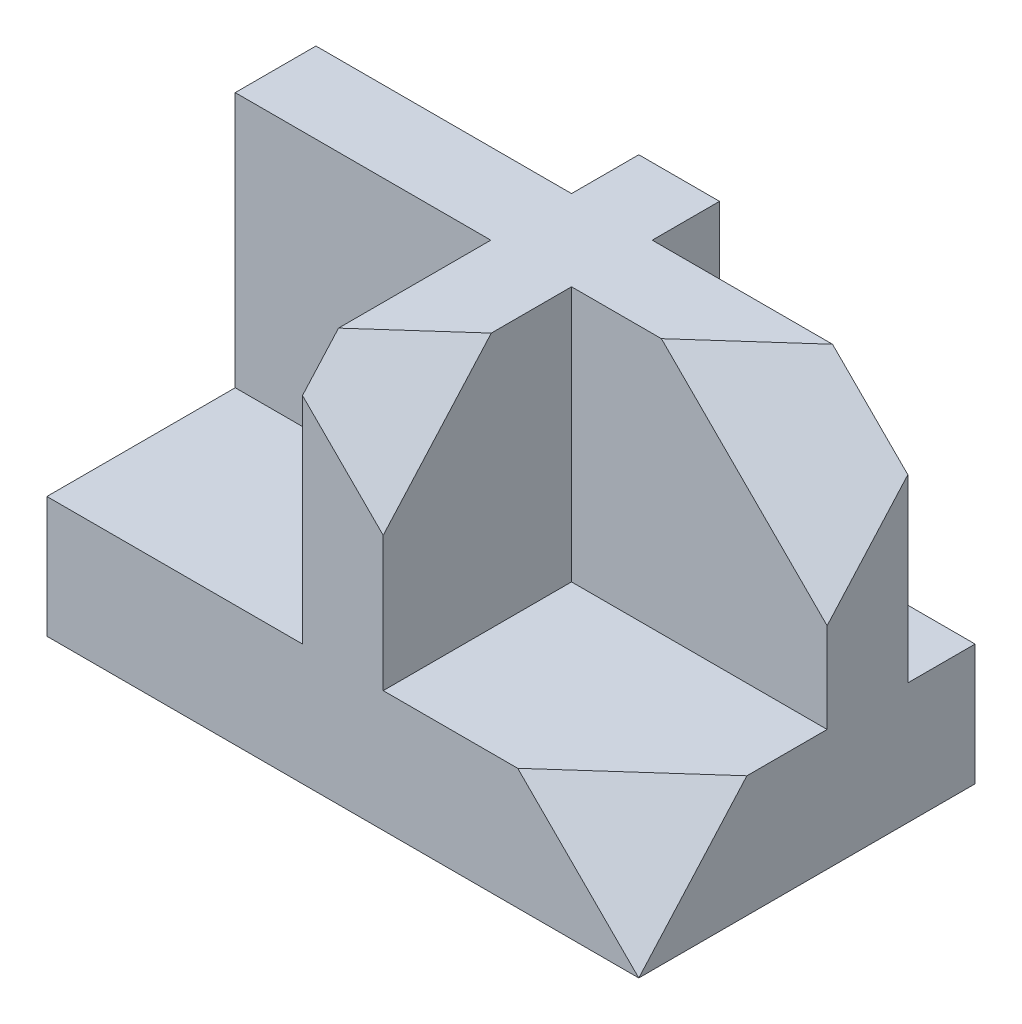
ISO-10303-21;
HEADER;
FILE_DESCRIPTION(('STEP AP214'),'2;1');
FILE_NAME('part.step','',(''),(''),'','','');
FILE_SCHEMA(('AUTOMOTIVE_DESIGN { 1 0 10303 214 1 1 1 1 }'));
ENDSEC;
DATA;
#1=APPLICATION_CONTEXT('core data for automotive mechanical design processes');
#2=APPLICATION_PROTOCOL_DEFINITION('international standard','automotive_design',2000,#1);
#3=PRODUCT_CONTEXT('',#1,'mechanical');
#4=PRODUCT('Part','Part','',(#3));
#5=PRODUCT_RELATED_PRODUCT_CATEGORY('part','',(#4));
#6=PRODUCT_DEFINITION_FORMATION('','',#4);
#7=PRODUCT_DEFINITION_CONTEXT('part definition',#1,'design');
#8=PRODUCT_DEFINITION('design','',#6,#7);
#9=PRODUCT_DEFINITION_SHAPE('','',#8);
#10=(LENGTH_UNIT() NAMED_UNIT(*) SI_UNIT(.MILLI.,.METRE.));
#11=(NAMED_UNIT(*) PLANE_ANGLE_UNIT() SI_UNIT($,.RADIAN.));
#12=(NAMED_UNIT(*) SI_UNIT($,.STERADIAN.) SOLID_ANGLE_UNIT());
#13=UNCERTAINTY_MEASURE_WITH_UNIT(LENGTH_MEASURE(1.E-05),#10,'distance_accuracy_value','');
#14=(GEOMETRIC_REPRESENTATION_CONTEXT(3) GLOBAL_UNCERTAINTY_ASSIGNED_CONTEXT((#13)) GLOBAL_UNIT_ASSIGNED_CONTEXT((#10,
#11,#12)) REPRESENTATION_CONTEXT('',''));
#15=CARTESIAN_POINT('',(0.,0.,0.));
#16=DIRECTION('',(0.,0.,1.));
#17=DIRECTION('',(1.,0.,0.));
#18=AXIS2_PLACEMENT_3D('',#15,#16,#17);
#19=CARTESIAN_POINT('',(0.,18.,0.));
#20=DIRECTION('',(0.,-1.,0.));
#21=DIRECTION('',(0.,0.,-1.));
#22=AXIS2_PLACEMENT_3D('',#19,#20,#21);
#23=PLANE('',#22);
#24=DIRECTION('',(-1.,0.,0.));
#25=VECTOR('',#24,1.);
#26=CARTESIAN_POINT('',(-44.,18.,-15.));
#27=LINE('',#26,#25);
#28=CARTESIAN_POINT('',(-6.,18.,-15.));
#29=VERTEX_POINT('',#28);
#30=CARTESIAN_POINT('',(-44.,18.,-15.));
#31=VERTEX_POINT('',#30);
#32=EDGE_CURVE('E294',#29,#31,#27,.T.);
#33=ORIENTED_EDGE('',*,*,#32,.F.);
#34=DIRECTION('',(0.,0.,1.));
#35=VECTOR('',#34,1.);
#36=CARTESIAN_POINT('',(-6.,18.,-15.));
#37=LINE('',#36,#35);
#38=CARTESIAN_POINT('',(-6.,18.,-25.));
#39=VERTEX_POINT('',#38);
#40=EDGE_CURVE('E290',#39,#29,#37,.T.);
#41=ORIENTED_EDGE('',*,*,#40,.F.);
#42=DIRECTION('',(-1.,0.,0.));
#43=VECTOR('',#42,1.);
#44=CARTESIAN_POINT('',(-44.,18.,-25.));
#45=LINE('',#44,#43);
#46=CARTESIAN_POINT('',(-44.,18.,-25.));
#47=VERTEX_POINT('',#46);
#48=EDGE_CURVE('E337',#39,#47,#45,.T.);
#49=ORIENTED_EDGE('',*,*,#48,.T.);
#50=DIRECTION('',(0.,0.,1.));
#51=VECTOR('',#50,1.);
#52=CARTESIAN_POINT('',(-44.,18.,25.));
#53=LINE('',#52,#51);
#54=EDGE_CURVE('E341',#47,#31,#53,.T.);
#55=ORIENTED_EDGE('',*,*,#54,.T.);
#56=EDGE_LOOP('',(#33,#41,#49,#55));
#57=FACE_BOUND('',#56,.T.);
#58=ADVANCED_FACE('F41',(#57),#23,.F.);
#59=DIRECTION('',(0.,0.,-1.));
#60=VECTOR('',#59,1.);
#61=CARTESIAN_POINT('',(6.,18.,-25.));
#62=LINE('',#61,#60);
#63=CARTESIAN_POINT('',(6.,18.,-15.));
#64=VERTEX_POINT('',#63);
#65=CARTESIAN_POINT('',(6.00000000000001,18.,-25.));
#66=VERTEX_POINT('',#65);
#67=EDGE_CURVE('E286',#64,#66,#62,.T.);
#68=ORIENTED_EDGE('',*,*,#67,.F.);
#69=DIRECTION('',(-1.,0.,0.));
#70=VECTOR('',#69,1.);
#71=CARTESIAN_POINT('',(6.,18.,-15.));
#72=LINE('',#71,#70);
#73=CARTESIAN_POINT('',(44.,18.,-15.));
#74=VERTEX_POINT('',#73);
#75=EDGE_CURVE('E283',#74,#64,#72,.T.);
#76=ORIENTED_EDGE('',*,*,#75,.F.);
#77=DIRECTION('',(0.,0.,-1.));
#78=VECTOR('',#77,1.);
#79=CARTESIAN_POINT('',(44.,18.,25.));
#80=LINE('',#79,#78);
#81=CARTESIAN_POINT('',(44.,18.,-25.));
#82=VERTEX_POINT('',#81);
#83=EDGE_CURVE('E200',#74,#82,#80,.T.);
#84=ORIENTED_EDGE('',*,*,#83,.T.);
#85=EDGE_CURVE('E338',#82,#66,#45,.T.);
#86=ORIENTED_EDGE('',*,*,#85,.T.);
#87=EDGE_LOOP('',(#68,#76,#84,#86));
#88=FACE_BOUND('',#87,.T.);
#89=ADVANCED_FACE('F411',(#88),#23,.F.);
#90=DIRECTION('',(1.,0.,0.));
#91=VECTOR('',#90,1.);
#92=CARTESIAN_POINT('',(-44.,18.,25.));
#93=LINE('',#92,#91);
#94=CARTESIAN_POINT('',(6.00000000000001,18.,25.));
#95=VERTEX_POINT('',#94);
#96=CARTESIAN_POINT('',(25.9999999999998,18.,25.));
#97=VERTEX_POINT('',#96);
#98=EDGE_CURVE('E343',#95,#97,#93,.T.);
#99=ORIENTED_EDGE('',*,*,#98,.T.);
#100=DIRECTION('',(0.745937661625918,0.,-0.666015769308848));
#101=VECTOR('',#100,1.);
#102=CARTESIAN_POINT('',(23.9531582682751,18.,26.8275372604685));
#103=LINE('',#102,#101);
#104=CARTESIAN_POINT('',(44.,18.,8.92857142857147));
#105=VERTEX_POINT('',#104);
#106=EDGE_CURVE('E57',#97,#105,#103,.T.);
#107=ORIENTED_EDGE('',*,*,#106,.T.);
#108=CARTESIAN_POINT('',(44.,18.,-3.));
#109=VERTEX_POINT('',#108);
#110=EDGE_CURVE('E186',#105,#109,#80,.T.);
#111=ORIENTED_EDGE('',*,*,#110,.T.);
#112=DIRECTION('',(1.,0.,0.));
#113=VECTOR('',#112,1.);
#114=CARTESIAN_POINT('',(44.,18.,-3.));
#115=LINE('',#114,#113);
#116=CARTESIAN_POINT('',(6.00000000000001,18.,-3.));
#117=VERTEX_POINT('',#116);
#118=EDGE_CURVE('E279',#117,#109,#115,.T.);
#119=ORIENTED_EDGE('',*,*,#118,.F.);
#120=DIRECTION('',(0.,0.,-1.));
#121=VECTOR('',#120,1.);
#122=CARTESIAN_POINT('',(6.00000000000001,18.,-3.));
#123=LINE('',#122,#121);
#124=EDGE_CURVE('E275',#95,#117,#123,.T.);
#125=ORIENTED_EDGE('',*,*,#124,.F.);
#126=EDGE_LOOP('',(#99,#107,#111,#119,#125));
#127=FACE_BOUND('',#126,.T.);
#128=ADVANCED_FACE('F402',(#127),#23,.F.);
#129=DIRECTION('',(0.,0.,1.));
#130=VECTOR('',#129,1.);
#131=CARTESIAN_POINT('',(-6.,18.,25.));
#132=LINE('',#131,#130);
#133=CARTESIAN_POINT('',(-6.,18.,-3.));
#134=VERTEX_POINT('',#133);
#135=CARTESIAN_POINT('',(-6.,18.,25.));
#136=VERTEX_POINT('',#135);
#137=EDGE_CURVE('E271',#134,#136,#132,.T.);
#138=ORIENTED_EDGE('',*,*,#137,.F.);
#139=DIRECTION('',(1.,0.,0.));
#140=VECTOR('',#139,1.);
#141=CARTESIAN_POINT('',(-6.,18.,-3.));
#142=LINE('',#141,#140);
#143=CARTESIAN_POINT('',(-44.,18.,-3.));
#144=VERTEX_POINT('',#143);
#145=EDGE_CURVE('E267',#144,#134,#142,.T.);
#146=ORIENTED_EDGE('',*,*,#145,.F.);
#147=CARTESIAN_POINT('',(-44.,18.,25.));
#148=VERTEX_POINT('',#147);
#149=EDGE_CURVE('E340',#144,#148,#53,.T.);
#150=ORIENTED_EDGE('',*,*,#149,.T.);
#151=EDGE_CURVE('E216',#148,#136,#93,.T.);
#152=ORIENTED_EDGE('',*,*,#151,.T.);
#153=EDGE_LOOP('',(#138,#146,#150,#152));
#154=FACE_BOUND('',#153,.T.);
#155=ADVANCED_FACE('F351',(#154),#23,.F.);
#156=CARTESIAN_POINT('',(44.,18.,25.));
#157=DIRECTION('',(-1.,0.,0.));
#158=DIRECTION('',(0.,0.,1.));
#159=AXIS2_PLACEMENT_3D('',#156,#157,#158);
#160=PLANE('',#159);
#161=DIRECTION('',(0.,-1.,0.));
#162=VECTOR('',#161,1.);
#163=CARTESIAN_POINT('',(44.,56.,-15.));
#164=LINE('',#163,#162);
#165=CARTESIAN_POINT('',(44.,44.8,-15.));
#166=VERTEX_POINT('',#165);
#167=EDGE_CURVE('E316',#166,#74,#164,.T.);
#168=ORIENTED_EDGE('',*,*,#167,.F.);
#169=DIRECTION('',(0.,0.745937661625915,-0.666015769308853));
#170=VECTOR('',#169,1.);
#171=CARTESIAN_POINT('',(44.,56.,-25.));
#172=LINE('',#171,#170);
#173=CARTESIAN_POINT('',(44.,31.36,-3.00000000000001));
#174=VERTEX_POINT('',#173);
#175=EDGE_CURVE('E188',#174,#166,#172,.T.);
#176=ORIENTED_EDGE('',*,*,#175,.F.);
#177=DIRECTION('',(0.,-1.,0.));
#178=VECTOR('',#177,1.);
#179=CARTESIAN_POINT('',(44.,56.,-3.));
#180=LINE('',#179,#178);
#181=EDGE_CURVE('E319',#174,#109,#180,.T.);
#182=ORIENTED_EDGE('',*,*,#181,.T.);
#183=ORIENTED_EDGE('',*,*,#110,.F.);
#184=CARTESIAN_POINT('',(44.,0.,25.));
#185=VERTEX_POINT('',#184);
#186=EDGE_CURVE('E170',#185,#105,#172,.T.);
#187=ORIENTED_EDGE('',*,*,#186,.F.);
#188=DIRECTION('',(0.,0.,-1.));
#189=VECTOR('',#188,1.);
#190=CARTESIAN_POINT('',(44.,0.,25.));
#191=LINE('',#190,#189);
#192=CARTESIAN_POINT('',(44.,0.,-25.));
#193=VERTEX_POINT('',#192);
#194=EDGE_CURVE('E184',#185,#193,#191,.T.);
#195=ORIENTED_EDGE('',*,*,#194,.T.);
#196=DIRECTION('',(0.,-1.,0.));
#197=VECTOR('',#196,1.);
#198=CARTESIAN_POINT('',(44.,18.,-25.));
#199=LINE('',#198,#197);
#200=EDGE_CURVE('E226',#82,#193,#199,.T.);
#201=ORIENTED_EDGE('',*,*,#200,.F.);
#202=ORIENTED_EDGE('',*,*,#83,.F.);
#203=EDGE_LOOP('',(#168,#176,#182,#183,#187,#195,#201,#202));
#204=FACE_BOUND('',#203,.T.);
#205=ADVANCED_FACE('F43',(#204),#160,.F.);
#206=CARTESIAN_POINT('',(-44.,18.,-25.));
#207=DIRECTION('',(0.,0.,1.));
#208=DIRECTION('',(1.,0.,0.));
#209=AXIS2_PLACEMENT_3D('',#206,#207,#208);
#210=PLANE('',#209);
#211=DIRECTION('',(-1.,0.,0.));
#212=VECTOR('',#211,1.);
#213=CARTESIAN_POINT('',(-44.,0.,-25.));
#214=LINE('',#213,#212);
#215=CARTESIAN_POINT('',(-44.,0.,-25.));
#216=VERTEX_POINT('',#215);
#217=EDGE_CURVE('E204',#193,#216,#214,.T.);
#218=ORIENTED_EDGE('',*,*,#217,.T.);
#219=DIRECTION('',(0.,-1.,0.));
#220=VECTOR('',#219,1.);
#221=CARTESIAN_POINT('',(-44.,18.,-25.));
#222=LINE('',#221,#220);
#223=EDGE_CURVE('E223',#47,#216,#222,.T.);
#224=ORIENTED_EDGE('',*,*,#223,.F.);
#225=ORIENTED_EDGE('',*,*,#48,.F.);
#226=DIRECTION('',(0.,-1.,0.));
#227=VECTOR('',#226,1.);
#228=CARTESIAN_POINT('',(-6.,56.,-25.));
#229=LINE('',#228,#227);
#230=CARTESIAN_POINT('',(-6.,56.,-25.));
#231=VERTEX_POINT('',#230);
#232=EDGE_CURVE('E306',#231,#39,#229,.T.);
#233=ORIENTED_EDGE('',*,*,#232,.F.);
#234=DIRECTION('',(-1.,0.,0.));
#235=VECTOR('',#234,1.);
#236=CARTESIAN_POINT('',(-6.,56.,-25.));
#237=LINE('',#236,#235);
#238=CARTESIAN_POINT('',(6.,56.,-25.));
#239=VERTEX_POINT('',#238);
#240=EDGE_CURVE('E252',#239,#231,#237,.T.);
#241=ORIENTED_EDGE('',*,*,#240,.F.);
#242=DIRECTION('',(0.,-1.,0.));
#243=VECTOR('',#242,1.);
#244=CARTESIAN_POINT('',(6.,56.,-25.));
#245=LINE('',#244,#243);
#246=EDGE_CURVE('E310',#239,#66,#245,.T.);
#247=ORIENTED_EDGE('',*,*,#246,.T.);
#248=ORIENTED_EDGE('',*,*,#85,.F.);
#249=ORIENTED_EDGE('',*,*,#200,.T.);
#250=EDGE_LOOP('',(#218,#224,#225,#233,#241,#247,#248,#249));
#251=FACE_BOUND('',#250,.T.);
#252=ADVANCED_FACE('F416',(#251),#210,.F.);
#253=CARTESIAN_POINT('',(-44.,18.,25.));
#254=DIRECTION('',(1.,0.,0.));
#255=DIRECTION('',(0.,0.,-1.));
#256=AXIS2_PLACEMENT_3D('',#253,#254,#255);
#257=PLANE('',#256);
#258=DIRECTION('',(0.,0.,1.));
#259=VECTOR('',#258,1.);
#260=CARTESIAN_POINT('',(-44.,0.,25.));
#261=LINE('',#260,#259);
#262=CARTESIAN_POINT('',(-44.,0.,25.));
#263=VERTEX_POINT('',#262);
#264=EDGE_CURVE('E201',#216,#263,#261,.T.);
#265=ORIENTED_EDGE('',*,*,#264,.T.);
#266=DIRECTION('',(0.,-1.,0.));
#267=VECTOR('',#266,1.);
#268=CARTESIAN_POINT('',(-44.,18.,25.));
#269=LINE('',#268,#267);
#270=EDGE_CURVE('E196',#148,#263,#269,.T.);
#271=ORIENTED_EDGE('',*,*,#270,.F.);
#272=ORIENTED_EDGE('',*,*,#149,.F.);
#273=DIRECTION('',(0.,-1.,0.));
#274=VECTOR('',#273,1.);
#275=CARTESIAN_POINT('',(-44.,56.,-2.99999999999999));
#276=LINE('',#275,#274);
#277=CARTESIAN_POINT('',(-44.,56.,-2.99999999999999));
#278=VERTEX_POINT('',#277);
#279=EDGE_CURVE('E207',#278,#144,#276,.T.);
#280=ORIENTED_EDGE('',*,*,#279,.F.);
#281=DIRECTION('',(0.,0.,1.));
#282=VECTOR('',#281,1.);
#283=CARTESIAN_POINT('',(-44.,56.,-2.99999999999999));
#284=LINE('',#283,#282);
#285=CARTESIAN_POINT('',(-44.,56.,-15.));
#286=VERTEX_POINT('',#285);
#287=EDGE_CURVE('E298',#286,#278,#284,.T.);
#288=ORIENTED_EDGE('',*,*,#287,.F.);
#289=DIRECTION('',(0.,-1.,0.));
#290=VECTOR('',#289,1.);
#291=CARTESIAN_POINT('',(-44.,56.,-15.));
#292=LINE('',#291,#290);
#293=EDGE_CURVE('E266',#286,#31,#292,.T.);
#294=ORIENTED_EDGE('',*,*,#293,.T.);
#295=ORIENTED_EDGE('',*,*,#54,.F.);
#296=ORIENTED_EDGE('',*,*,#223,.T.);
#297=EDGE_LOOP('',(#265,#271,#272,#280,#288,#294,#295,#296));
#298=FACE_BOUND('',#297,.T.);
#299=ADVANCED_FACE('F354',(#298),#257,.F.);
#300=CARTESIAN_POINT('',(-44.,18.,25.));
#301=DIRECTION('',(0.,0.,-1.));
#302=DIRECTION('',(-1.,0.,0.));
#303=AXIS2_PLACEMENT_3D('',#300,#301,#302);
#304=PLANE('',#303);
#305=DIRECTION('',(1.,0.,0.));
#306=VECTOR('',#305,1.);
#307=CARTESIAN_POINT('',(-44.,0.,25.));
#308=LINE('',#307,#306);
#309=EDGE_CURVE('E192',#263,#185,#308,.T.);
#310=ORIENTED_EDGE('',*,*,#309,.T.);
#311=DIRECTION('',(0.707106781186552,-0.707106781186544,0.));
#312=VECTOR('',#311,1.);
#313=CARTESIAN_POINT('',(44.,0.,25.));
#314=LINE('',#313,#312);
#315=EDGE_CURVE('E167',#97,#185,#314,.T.);
#316=ORIENTED_EDGE('',*,*,#315,.F.);
#317=ORIENTED_EDGE('',*,*,#98,.F.);
#318=DIRECTION('',(0.,-1.,0.));
#319=VECTOR('',#318,1.);
#320=CARTESIAN_POINT('',(6.00000000000001,56.,25.));
#321=LINE('',#320,#319);
#322=CARTESIAN_POINT('',(6.,37.9999999999996,25.));
#323=VERTEX_POINT('',#322);
#324=EDGE_CURVE('E326',#323,#95,#321,.T.);
#325=ORIENTED_EDGE('',*,*,#324,.F.);
#326=CARTESIAN_POINT('',(-6.00000000000001,49.9999999999995,25.));
#327=VERTEX_POINT('',#326);
#328=EDGE_CURVE('E176',#327,#323,#314,.T.);
#329=ORIENTED_EDGE('',*,*,#328,.F.);
#330=DIRECTION('',(0.,-1.,0.));
#331=VECTOR('',#330,1.);
#332=CARTESIAN_POINT('',(-6.,56.,25.));
#333=LINE('',#332,#331);
#334=EDGE_CURVE('E329',#327,#136,#333,.T.);
#335=ORIENTED_EDGE('',*,*,#334,.T.);
#336=ORIENTED_EDGE('',*,*,#151,.F.);
#337=ORIENTED_EDGE('',*,*,#270,.T.);
#338=EDGE_LOOP('',(#310,#316,#317,#325,#329,#335,#336,#337));
#339=FACE_BOUND('',#338,.T.);
#340=ADVANCED_FACE('F193',(#339),#304,.F.);
#341=CARTESIAN_POINT('',(0.,0.,0.));
#342=DIRECTION('',(0.,-1.,0.));
#343=DIRECTION('',(0.,0.,-1.));
#344=AXIS2_PLACEMENT_3D('',#341,#342,#343);
#345=PLANE('',#344);
#346=ORIENTED_EDGE('',*,*,#194,.F.);
#347=ORIENTED_EDGE('',*,*,#309,.F.);
#348=ORIENTED_EDGE('',*,*,#264,.F.);
#349=ORIENTED_EDGE('',*,*,#217,.F.);
#350=EDGE_LOOP('',(#346,#347,#348,#349));
#351=FACE_BOUND('',#350,.T.);
#352=ADVANCED_FACE('F203',(#351),#345,.T.);
#353=CARTESIAN_POINT('',(-6.,56.,-3.));
#354=DIRECTION('',(0.,0.,-1.));
#355=DIRECTION('',(-1.,0.,0.));
#356=AXIS2_PLACEMENT_3D('',#353,#354,#355);
#357=PLANE('',#356);
#358=ORIENTED_EDGE('',*,*,#145,.T.);
#359=DIRECTION('',(0.,-1.,0.));
#360=VECTOR('',#359,1.);
#361=CARTESIAN_POINT('',(-6.,56.,-3.));
#362=LINE('',#361,#360);
#363=CARTESIAN_POINT('',(-6.,56.,-3.));
#364=VERTEX_POINT('',#363);
#365=EDGE_CURVE('E213',#364,#134,#362,.T.);
#366=ORIENTED_EDGE('',*,*,#365,.F.);
#367=DIRECTION('',(1.,0.,0.));
#368=VECTOR('',#367,1.);
#369=CARTESIAN_POINT('',(-6.,56.,-3.));
#370=LINE('',#369,#368);
#371=EDGE_CURVE('E367',#278,#364,#370,.T.);
#372=ORIENTED_EDGE('',*,*,#371,.F.);
#373=ORIENTED_EDGE('',*,*,#279,.T.);
#374=EDGE_LOOP('',(#358,#366,#372,#373));
#375=FACE_BOUND('',#374,.T.);
#376=ADVANCED_FACE('F366',(#375),#357,.F.);
#377=CARTESIAN_POINT('',(-6.,56.,25.));
#378=DIRECTION('',(1.,0.,0.));
#379=DIRECTION('',(0.,0.,-1.));
#380=AXIS2_PLACEMENT_3D('',#377,#378,#379);
#381=PLANE('',#380);
#382=ORIENTED_EDGE('',*,*,#334,.F.);
#383=DIRECTION('',(0.,0.745937661625915,-0.666015769308852));
#384=VECTOR('',#383,1.);
#385=CARTESIAN_POINT('',(-6.,53.3385379701914,22.0191625266144));
#386=LINE('',#385,#384);
#387=CARTESIAN_POINT('',(-6.,56.,19.6428571428567));
#388=VERTEX_POINT('',#387);
#389=EDGE_CURVE('E363',#327,#388,#386,.T.);
#390=ORIENTED_EDGE('',*,*,#389,.T.);
#391=DIRECTION('',(0.,0.,1.));
#392=VECTOR('',#391,1.);
#393=CARTESIAN_POINT('',(-6.,56.,25.));
#394=LINE('',#393,#392);
#395=EDGE_CURVE('E374',#364,#388,#394,.T.);
#396=ORIENTED_EDGE('',*,*,#395,.F.);
#397=ORIENTED_EDGE('',*,*,#365,.T.);
#398=ORIENTED_EDGE('',*,*,#137,.T.);
#399=EDGE_LOOP('',(#382,#390,#396,#397,#398));
#400=FACE_BOUND('',#399,.T.);
#401=ADVANCED_FACE('F361',(#400),#381,.F.);
#402=CARTESIAN_POINT('',(6.00000000000001,56.,-3.));
#403=DIRECTION('',(-1.,0.,0.));
#404=DIRECTION('',(0.,0.,1.));
#405=AXIS2_PLACEMENT_3D('',#402,#403,#404);
#406=PLANE('',#405);
#407=DIRECTION('',(0.,0.,-1.));
#408=VECTOR('',#407,1.);
#409=CARTESIAN_POINT('',(6.00000000000001,56.,-3.));
#410=LINE('',#409,#408);
#411=CARTESIAN_POINT('',(6.00000000000001,56.,8.92857142857107));
#412=VERTEX_POINT('',#411);
#413=CARTESIAN_POINT('',(6.00000000000001,56.,-3.));
#414=VERTEX_POINT('',#413);
#415=EDGE_CURVE('E254',#412,#414,#410,.T.);
#416=ORIENTED_EDGE('',*,*,#415,.F.);
#417=DIRECTION('',(0.,-0.745937661625914,0.666015769308852));
#418=VECTOR('',#417,1.);
#419=CARTESIAN_POINT('',(6.00000000000001,61.9261887863731,3.63733144073791));
#420=LINE('',#419,#418);
#421=EDGE_CURVE('E393',#412,#323,#420,.T.);
#422=ORIENTED_EDGE('',*,*,#421,.T.);
#423=ORIENTED_EDGE('',*,*,#324,.T.);
#424=ORIENTED_EDGE('',*,*,#124,.T.);
#425=DIRECTION('',(0.,-1.,0.));
#426=VECTOR('',#425,1.);
#427=CARTESIAN_POINT('',(6.00000000000001,56.,-3.));
#428=LINE('',#427,#426);
#429=EDGE_CURVE('E322',#414,#117,#428,.T.);
#430=ORIENTED_EDGE('',*,*,#429,.F.);
#431=EDGE_LOOP('',(#416,#422,#423,#424,#430));
#432=FACE_BOUND('',#431,.T.);
#433=ADVANCED_FACE('F385',(#432),#406,.F.);
#434=CARTESIAN_POINT('',(44.,56.,-3.));
#435=DIRECTION('',(0.,0.,-1.));
#436=DIRECTION('',(-1.,0.,0.));
#437=AXIS2_PLACEMENT_3D('',#434,#435,#436);
#438=PLANE('',#437);
#439=ORIENTED_EDGE('',*,*,#181,.F.);
#440=DIRECTION('',(-0.707106781186552,0.707106781186543,0.));
#441=VECTOR('',#440,1.);
#442=CARTESIAN_POINT('',(31.68,43.6799999999999,-3.));
#443=LINE('',#442,#441);
#444=CARTESIAN_POINT('',(19.3599999999997,56.,-3.00000000000001));
#445=VERTEX_POINT('',#444);
#446=EDGE_CURVE('E390',#174,#445,#443,.T.);
#447=ORIENTED_EDGE('',*,*,#446,.T.);
#448=DIRECTION('',(1.,0.,0.));
#449=VECTOR('',#448,1.);
#450=CARTESIAN_POINT('',(44.,56.,-3.));
#451=LINE('',#450,#449);
#452=EDGE_CURVE('E239',#414,#445,#451,.T.);
#453=ORIENTED_EDGE('',*,*,#452,.F.);
#454=ORIENTED_EDGE('',*,*,#429,.T.);
#455=ORIENTED_EDGE('',*,*,#118,.T.);
#456=EDGE_LOOP('',(#439,#447,#453,#454,#455));
#457=FACE_BOUND('',#456,.T.);
#458=ADVANCED_FACE('F389',(#457),#438,.F.);
#459=CARTESIAN_POINT('',(6.,56.,-15.));
#460=DIRECTION('',(0.,0.,1.));
#461=DIRECTION('',(1.,0.,0.));
#462=AXIS2_PLACEMENT_3D('',#459,#460,#461);
#463=PLANE('',#462);
#464=DIRECTION('',(-1.,0.,0.));
#465=VECTOR('',#464,1.);
#466=CARTESIAN_POINT('',(6.,56.,-15.));
#467=LINE('',#466,#465);
#468=CARTESIAN_POINT('',(32.7999999999999,56.,-15.));
#469=VERTEX_POINT('',#468);
#470=CARTESIAN_POINT('',(6.,56.,-15.));
#471=VERTEX_POINT('',#470);
#472=EDGE_CURVE('E236',#469,#471,#467,.T.);
#473=ORIENTED_EDGE('',*,*,#472,.F.);
#474=DIRECTION('',(0.707106781186552,-0.707106781186543,0.));
#475=VECTOR('',#474,1.);
#476=CARTESIAN_POINT('',(19.3999999999998,69.3999999999999,-15.));
#477=LINE('',#476,#475);
#478=EDGE_CURVE('E65',#469,#166,#477,.T.);
#479=ORIENTED_EDGE('',*,*,#478,.T.);
#480=ORIENTED_EDGE('',*,*,#167,.T.);
#481=ORIENTED_EDGE('',*,*,#75,.T.);
#482=DIRECTION('',(0.,-1.,0.));
#483=VECTOR('',#482,1.);
#484=CARTESIAN_POINT('',(6.,56.,-15.));
#485=LINE('',#484,#483);
#486=EDGE_CURVE('E245',#471,#64,#485,.T.);
#487=ORIENTED_EDGE('',*,*,#486,.F.);
#488=EDGE_LOOP('',(#473,#479,#480,#481,#487));
#489=FACE_BOUND('',#488,.T.);
#490=ADVANCED_FACE('F242',(#489),#463,.F.);
#491=CARTESIAN_POINT('',(6.,56.,-25.));
#492=DIRECTION('',(-1.,0.,0.));
#493=DIRECTION('',(0.,0.,1.));
#494=AXIS2_PLACEMENT_3D('',#491,#492,#493);
#495=PLANE('',#494);
#496=ORIENTED_EDGE('',*,*,#67,.T.);
#497=ORIENTED_EDGE('',*,*,#246,.F.);
#498=DIRECTION('',(0.,0.,-1.));
#499=VECTOR('',#498,1.);
#500=CARTESIAN_POINT('',(6.,56.,-25.));
#501=LINE('',#500,#499);
#502=EDGE_CURVE('E248',#471,#239,#501,.T.);
#503=ORIENTED_EDGE('',*,*,#502,.F.);
#504=ORIENTED_EDGE('',*,*,#486,.T.);
#505=EDGE_LOOP('',(#496,#497,#503,#504));
#506=FACE_BOUND('',#505,.T.);
#507=ADVANCED_FACE('F414',(#506),#495,.F.);
#508=CARTESIAN_POINT('',(-6.,56.,-15.));
#509=DIRECTION('',(1.,0.,0.));
#510=DIRECTION('',(0.,0.,-1.));
#511=AXIS2_PLACEMENT_3D('',#508,#509,#510);
#512=PLANE('',#511);
#513=ORIENTED_EDGE('',*,*,#40,.T.);
#514=DIRECTION('',(0.,-1.,0.));
#515=VECTOR('',#514,1.);
#516=CARTESIAN_POINT('',(-6.,56.,-15.));
#517=LINE('',#516,#515);
#518=CARTESIAN_POINT('',(-6.,56.,-15.));
#519=VERTEX_POINT('',#518);
#520=EDGE_CURVE('E302',#519,#29,#517,.T.);
#521=ORIENTED_EDGE('',*,*,#520,.F.);
#522=DIRECTION('',(0.,0.,1.));
#523=VECTOR('',#522,1.);
#524=CARTESIAN_POINT('',(-6.,56.,-15.));
#525=LINE('',#524,#523);
#526=EDGE_CURVE('E260',#231,#519,#525,.T.);
#527=ORIENTED_EDGE('',*,*,#526,.F.);
#528=ORIENTED_EDGE('',*,*,#232,.T.);
#529=EDGE_LOOP('',(#513,#521,#527,#528));
#530=FACE_BOUND('',#529,.T.);
#531=ADVANCED_FACE('F423',(#530),#512,.F.);
#532=CARTESIAN_POINT('',(-44.,56.,-15.));
#533=DIRECTION('',(0.,0.,1.));
#534=DIRECTION('',(1.,0.,0.));
#535=AXIS2_PLACEMENT_3D('',#532,#533,#534);
#536=PLANE('',#535);
#537=ORIENTED_EDGE('',*,*,#32,.T.);
#538=ORIENTED_EDGE('',*,*,#293,.F.);
#539=DIRECTION('',(-1.,0.,0.));
#540=VECTOR('',#539,1.);
#541=CARTESIAN_POINT('',(-44.,56.,-15.));
#542=LINE('',#541,#540);
#543=EDGE_CURVE('E263',#519,#286,#542,.T.);
#544=ORIENTED_EDGE('',*,*,#543,.F.);
#545=ORIENTED_EDGE('',*,*,#520,.T.);
#546=EDGE_LOOP('',(#537,#538,#544,#545));
#547=FACE_BOUND('',#546,.T.);
#548=ADVANCED_FACE('F425',(#547),#536,.F.);
#549=CARTESIAN_POINT('',(0.,56.,0.));
#550=DIRECTION('',(0.,-1.,0.));
#551=DIRECTION('',(0.,0.,-1.));
#552=AXIS2_PLACEMENT_3D('',#549,#550,#551);
#553=PLANE('',#552);
#554=ORIENTED_EDGE('',*,*,#395,.T.);
#555=DIRECTION('',(0.745937661625918,0.,-0.666015769308848));
#556=VECTOR('',#555,1.);
#557=CARTESIAN_POINT('',(7.09723207948878,56.,7.94889992902753));
#558=LINE('',#557,#556);
#559=EDGE_CURVE('E11',#388,#412,#558,.T.);
#560=ORIENTED_EDGE('',*,*,#559,.T.);
#561=ORIENTED_EDGE('',*,*,#415,.T.);
#562=ORIENTED_EDGE('',*,*,#452,.T.);
#563=EDGE_CURVE('E45',#445,#469,#558,.T.);
#564=ORIENTED_EDGE('',*,*,#563,.T.);
#565=ORIENTED_EDGE('',*,*,#472,.T.);
#566=ORIENTED_EDGE('',*,*,#502,.T.);
#567=ORIENTED_EDGE('',*,*,#240,.T.);
#568=ORIENTED_EDGE('',*,*,#526,.T.);
#569=ORIENTED_EDGE('',*,*,#543,.T.);
#570=ORIENTED_EDGE('',*,*,#287,.T.);
#571=ORIENTED_EDGE('',*,*,#371,.T.);
#572=EDGE_LOOP('',(#554,#560,#561,#562,#564,#565,#566,#567,#568,#569,#570,#571));
#573=FACE_BOUND('',#572,.T.);
#574=ADVANCED_FACE('F235',(#573),#553,.F.);
#575=CARTESIAN_POINT('',(22.1238938053095,22.1238938053098,24.7787610619469));
#576=DIRECTION('',(-0.554325087698112,-0.554325087698118,-0.620844098221892));
#577=DIRECTION('',(0.,0.745937661625915,-0.666015769308852));
#578=AXIS2_PLACEMENT_3D('',#575,#576,#577);
#579=PLANE('',#578);
#580=ORIENTED_EDGE('',*,*,#175,.T.);
#581=ORIENTED_EDGE('',*,*,#478,.F.);
#582=ORIENTED_EDGE('',*,*,#563,.F.);
#583=ORIENTED_EDGE('',*,*,#446,.F.);
#584=EDGE_LOOP('',(#580,#581,#582,#583));
#585=FACE_BOUND('',#584,.T.);
#586=ADVANCED_FACE('F407',(#585),#579,.F.);
#587=ORIENTED_EDGE('',*,*,#328,.T.);
#588=ORIENTED_EDGE('',*,*,#421,.F.);
#589=ORIENTED_EDGE('',*,*,#559,.F.);
#590=ORIENTED_EDGE('',*,*,#389,.F.);
#591=EDGE_LOOP('',(#587,#588,#589,#590));
#592=FACE_BOUND('',#591,.T.);
#593=ADVANCED_FACE('F404',(#592),#579,.F.);
#594=ORIENTED_EDGE('',*,*,#315,.T.);
#595=ORIENTED_EDGE('',*,*,#186,.T.);
#596=ORIENTED_EDGE('',*,*,#106,.F.);
#597=EDGE_LOOP('',(#594,#595,#596));
#598=FACE_BOUND('',#597,.T.);
#599=ADVANCED_FACE('F169',(#598),#579,.F.);
#600=CLOSED_SHELL('',(#58,#89,#128,#155,#205,#252,#299,#340,#352,#376,#401,#433,#458,#490,#507,
#531,#548,#574,#586,#593,#599));
#601=MANIFOLD_SOLID_BREP('B2',#600);
#602=ADVANCED_BREP_SHAPE_REPRESENTATION('',(#18,#601),#14);
#603=SHAPE_DEFINITION_REPRESENTATION(#9,#602);
ENDSEC;
END-ISO-10303-21;
